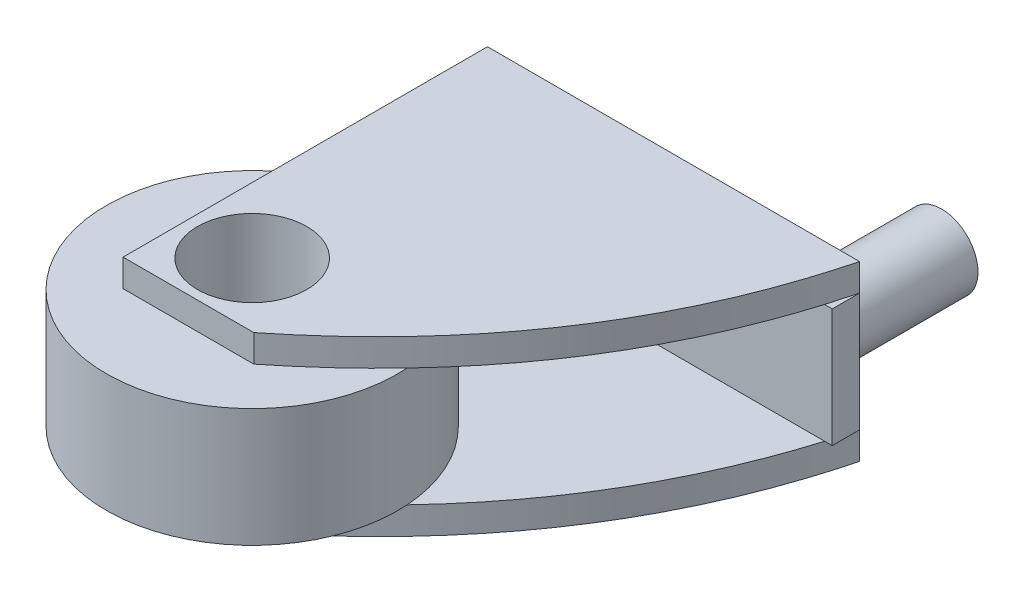
ISO-10303-21;
HEADER;
FILE_DESCRIPTION(('STEP AP214'),'2;1');
FILE_NAME('part.step','',(''),(''),'','','');
FILE_SCHEMA(('AUTOMOTIVE_DESIGN { 1 0 10303 214 1 1 1 1 }'));
ENDSEC;
DATA;
#1=APPLICATION_CONTEXT('core data for automotive mechanical design processes');
#2=APPLICATION_PROTOCOL_DEFINITION('international standard','automotive_design',2000,#1);
#3=PRODUCT_CONTEXT('',#1,'mechanical');
#4=PRODUCT('Part','Part','',(#3));
#5=PRODUCT_RELATED_PRODUCT_CATEGORY('part','',(#4));
#6=PRODUCT_DEFINITION_FORMATION('','',#4);
#7=PRODUCT_DEFINITION_CONTEXT('part definition',#1,'design');
#8=PRODUCT_DEFINITION('design','',#6,#7);
#9=PRODUCT_DEFINITION_SHAPE('','',#8);
#10=(LENGTH_UNIT() NAMED_UNIT(*) SI_UNIT(.MILLI.,.METRE.));
#11=(NAMED_UNIT(*) PLANE_ANGLE_UNIT() SI_UNIT($,.RADIAN.));
#12=(NAMED_UNIT(*) SI_UNIT($,.STERADIAN.) SOLID_ANGLE_UNIT());
#13=UNCERTAINTY_MEASURE_WITH_UNIT(LENGTH_MEASURE(1.E-05),#10,'distance_accuracy_value','');
#14=(GEOMETRIC_REPRESENTATION_CONTEXT(3) GLOBAL_UNCERTAINTY_ASSIGNED_CONTEXT((#13)) GLOBAL_UNIT_ASSIGNED_CONTEXT((#10,
#11,#12)) REPRESENTATION_CONTEXT('',''));
#15=CARTESIAN_POINT('',(0.,0.,0.));
#16=DIRECTION('',(0.,0.,1.));
#17=DIRECTION('',(1.,0.,0.));
#18=AXIS2_PLACEMENT_3D('',#15,#16,#17);
#19=CARTESIAN_POINT('',(23.9622706191758,13.,-11.0935546528052));
#20=DIRECTION('',(0.,1.,0.));
#21=DIRECTION('',(0.,0.,1.));
#22=AXIS2_PLACEMENT_3D('',#19,#20,#21);
#23=PLANE('',#22);
#24=DIRECTION('',(-1.,0.,0.));
#25=VECTOR('',#24,1.);
#26=CARTESIAN_POINT('',(0.,13.,-30.));
#27=LINE('',#26,#25);
#28=CARTESIAN_POINT('',(32.8241863871167,13.,-30.));
#29=VERTEX_POINT('',#28);
#30=CARTESIAN_POINT('',(-7.17425851162196,13.,-30.));
#31=VERTEX_POINT('',#30);
#32=EDGE_CURVE('E124',#29,#31,#27,.T.);
#33=ORIENTED_EDGE('',*,*,#32,.F.);
#34=CARTESIAN_POINT('',(7.17425851162196,13.,6.9947751022262));
#35=CARTESIAN_POINT('',(27.5045815804378,13.,-9.18449685672359));
#36=CARTESIAN_POINT('',(33.6656608042057,13.,-33.));
#37=B_SPLINE_CURVE_WITH_KNOTS('',2,(#34,#35,#36),.UNSPECIFIED.,.F.,.F.,(3,3),(0.,1.),.UNSPECIFIED.);
#38=CARTESIAN_POINT('',(15.9654632648895,13.,-1.0507058282246));
#39=VERTEX_POINT('',#38);
#40=EDGE_CURVE('E193',#39,#29,#37,.T.);
#41=ORIENTED_EDGE('',*,*,#40,.F.);
#42=CARTESIAN_POINT('',(0.,13.,0.));
#43=DIRECTION('',(0.,1.,0.));
#44=DIRECTION('',(0.,0.,1.));
#45=AXIS2_PLACEMENT_3D('',#42,#43,#44);
#46=CIRCLE('',#45,16.);
#47=CARTESIAN_POINT('',(-7.17425851162196,13.,-14.301399050737));
#48=VERTEX_POINT('',#47);
#49=EDGE_CURVE('E149',#39,#48,#46,.T.);
#50=ORIENTED_EDGE('',*,*,#49,.T.);
#51=DIRECTION('',(0.,0.,1.));
#52=VECTOR('',#51,1.);
#53=CARTESIAN_POINT('',(-7.17425851162196,13.,6.9947751022262));
#54=LINE('',#53,#52);
#55=EDGE_CURVE('E140',#31,#48,#54,.T.);
#56=ORIENTED_EDGE('',*,*,#55,.F.);
#57=EDGE_LOOP('',(#33,#41,#50,#56));
#58=FACE_BOUND('',#57,.T.);
#59=ADVANCED_FACE('F35',(#58),#23,.F.);
#60=CARTESIAN_POINT('',(23.9622706191758,0.,-11.0935546528052));
#61=DIRECTION('',(0.,-1.,0.));
#62=DIRECTION('',(0.,0.,1.));
#63=AXIS2_PLACEMENT_3D('',#60,#61,#62);
#64=PLANE('',#63);
#65=DIRECTION('',(-1.,0.,0.));
#66=VECTOR('',#65,1.);
#67=CARTESIAN_POINT('',(0.,0.,-30.));
#68=LINE('',#67,#66);
#69=CARTESIAN_POINT('',(32.8241863871174,0.,-30.0000000000002));
#70=VERTEX_POINT('',#69);
#71=CARTESIAN_POINT('',(-7.17425851162196,0.,-30.));
#72=VERTEX_POINT('',#71);
#73=EDGE_CURVE('E327',#70,#72,#68,.T.);
#74=ORIENTED_EDGE('',*,*,#73,.T.);
#75=DIRECTION('',(0.,0.,1.));
#76=VECTOR('',#75,1.);
#77=CARTESIAN_POINT('',(-7.17425851162196,0.,6.9947751022262));
#78=LINE('',#77,#76);
#79=CARTESIAN_POINT('',(-7.17425851162196,0.,-14.3013990507369));
#80=VERTEX_POINT('',#79);
#81=EDGE_CURVE('E143',#72,#80,#78,.T.);
#82=ORIENTED_EDGE('',*,*,#81,.T.);
#83=CARTESIAN_POINT('',(0.,0.,0.));
#84=DIRECTION('',(0.,1.,0.));
#85=DIRECTION('',(0.,0.,1.));
#86=AXIS2_PLACEMENT_3D('',#83,#84,#85);
#87=CIRCLE('',#86,16.);
#88=CARTESIAN_POINT('',(15.9654632648895,0.,-1.0507058282246));
#89=VERTEX_POINT('',#88);
#90=EDGE_CURVE('E166',#89,#80,#87,.T.);
#91=ORIENTED_EDGE('',*,*,#90,.F.);
#92=CARTESIAN_POINT('',(7.17425851162196,0.,6.9947751022262));
#93=CARTESIAN_POINT('',(27.5045815804378,0.,-9.18449685672359));
#94=CARTESIAN_POINT('',(33.6656608042057,0.,-33.));
#95=B_SPLINE_CURVE_WITH_KNOTS('',2,(#92,#93,#94),.UNSPECIFIED.,.F.,.F.,(3,3),(0.,1.),.UNSPECIFIED.);
#96=EDGE_CURVE('E54',#89,#70,#95,.T.);
#97=ORIENTED_EDGE('',*,*,#96,.T.);
#98=EDGE_LOOP('',(#74,#82,#91,#97));
#99=FACE_BOUND('',#98,.T.);
#100=ADVANCED_FACE('F242',(#99),#64,.F.);
#101=CARTESIAN_POINT('',(0.,13.,0.));
#102=DIRECTION('',(0.,1.,0.));
#103=DIRECTION('',(0.,0.,1.));
#104=AXIS2_PLACEMENT_3D('',#101,#102,#103);
#105=PLANE('',#104);
#106=CARTESIAN_POINT('',(-7.17425851162196,13.,6.9947751022262));
#107=VERTEX_POINT('',#106);
#108=EDGE_CURVE('E153',#48,#107,#54,.T.);
#109=ORIENTED_EDGE('',*,*,#108,.F.);
#110=EDGE_CURVE('E164',#48,#39,#46,.T.);
#111=ORIENTED_EDGE('',*,*,#110,.T.);
#112=CARTESIAN_POINT('',(7.17425851162196,13.,6.9947751022262));
#113=VERTEX_POINT('',#112);
#114=EDGE_CURVE('E189',#113,#39,#37,.T.);
#115=ORIENTED_EDGE('',*,*,#114,.F.);
#116=DIRECTION('',(1.,0.,0.));
#117=VECTOR('',#116,1.);
#118=CARTESIAN_POINT('',(-7.17425851162196,13.,6.9947751022262));
#119=LINE('',#118,#117);
#120=EDGE_CURVE('E150',#107,#113,#119,.T.);
#121=ORIENTED_EDGE('',*,*,#120,.F.);
#122=EDGE_LOOP('',(#109,#111,#115,#121));
#123=FACE_BOUND('',#122,.T.);
#124=ADVANCED_FACE('F239',(#123),#105,.T.);
#125=CARTESIAN_POINT('',(0.,0.,0.));
#126=DIRECTION('',(0.,1.,0.));
#127=DIRECTION('',(0.,0.,1.));
#128=AXIS2_PLACEMENT_3D('',#125,#126,#127);
#129=PLANE('',#128);
#130=EDGE_CURVE('E171',#80,#89,#87,.T.);
#131=ORIENTED_EDGE('',*,*,#130,.F.);
#132=CARTESIAN_POINT('',(-7.17425851162196,0.,6.9947751022262));
#133=VERTEX_POINT('',#132);
#134=EDGE_CURVE('E43',#80,#133,#78,.T.);
#135=ORIENTED_EDGE('',*,*,#134,.T.);
#136=DIRECTION('',(1.,0.,0.));
#137=VECTOR('',#136,1.);
#138=CARTESIAN_POINT('',(-7.17425851162196,0.,6.9947751022262));
#139=LINE('',#138,#137);
#140=CARTESIAN_POINT('',(7.17425851162196,0.,6.9947751022262));
#141=VERTEX_POINT('',#140);
#142=EDGE_CURVE('E288',#133,#141,#139,.T.);
#143=ORIENTED_EDGE('',*,*,#142,.T.);
#144=EDGE_CURVE('E283',#141,#89,#95,.T.);
#145=ORIENTED_EDGE('',*,*,#144,.T.);
#146=EDGE_LOOP('',(#131,#135,#143,#145));
#147=FACE_BOUND('',#146,.T.);
#148=ADVANCED_FACE('F241',(#147),#129,.F.);
#149=CARTESIAN_POINT('',(0.,13.,0.));
#150=DIRECTION('',(0.,-1.,0.));
#151=DIRECTION('',(0.,0.,-1.));
#152=AXIS2_PLACEMENT_3D('',#149,#150,#151);
#153=CYLINDRICAL_SURFACE('',#152,16.);
#154=ORIENTED_EDGE('',*,*,#49,.F.);
#155=ORIENTED_EDGE('',*,*,#110,.F.);
#156=EDGE_LOOP('',(#154,#155));
#157=FACE_BOUND('',#156,.T.);
#158=ORIENTED_EDGE('',*,*,#90,.T.);
#159=ORIENTED_EDGE('',*,*,#130,.T.);
#160=EDGE_LOOP('',(#158,#159));
#161=FACE_BOUND('',#160,.T.);
#162=ADVANCED_FACE('F37',(#157,#161),#153,.T.);
#163=CARTESIAN_POINT('',(23.9622706191758,16.,-11.0935546528052));
#164=DIRECTION('',(0.,1.,0.));
#165=DIRECTION('',(0.,0.,1.));
#166=AXIS2_PLACEMENT_3D('',#163,#164,#165);
#167=PLANE('',#166);
#168=CARTESIAN_POINT('',(0.,16.,0.));
#169=DIRECTION('',(0.,1.,0.));
#170=DIRECTION('',(0.,0.,1.));
#171=AXIS2_PLACEMENT_3D('',#168,#169,#170);
#172=CIRCLE('',#171,6.);
#173=CARTESIAN_POINT('',(0.,16.,-6.));
#174=VERTEX_POINT('',#173);
#175=EDGE_CURVE('E331',#174,#174,#172,.T.);
#176=ORIENTED_EDGE('',*,*,#175,.F.);
#177=EDGE_LOOP('',(#176));
#178=FACE_BOUND('',#177,.T.);
#179=DIRECTION('',(0.,0.,1.));
#180=VECTOR('',#179,1.);
#181=CARTESIAN_POINT('',(-7.17425851162196,16.,6.9947751022262));
#182=LINE('',#181,#180);
#183=CARTESIAN_POINT('',(-7.17425851162196,16.,-33.));
#184=VERTEX_POINT('',#183);
#185=CARTESIAN_POINT('',(-7.17425851162196,16.,6.9947751022262));
#186=VERTEX_POINT('',#185);
#187=EDGE_CURVE('E192',#184,#186,#182,.T.);
#188=ORIENTED_EDGE('',*,*,#187,.T.);
#189=DIRECTION('',(1.,0.,0.));
#190=VECTOR('',#189,1.);
#191=CARTESIAN_POINT('',(-7.17425851162196,16.,6.9947751022262));
#192=LINE('',#191,#190);
#193=CARTESIAN_POINT('',(7.17425851162196,16.,6.9947751022262));
#194=VERTEX_POINT('',#193);
#195=EDGE_CURVE('E198',#186,#194,#192,.T.);
#196=ORIENTED_EDGE('',*,*,#195,.T.);
#197=CARTESIAN_POINT('',(7.17425851162196,16.,6.9947751022262));
#198=CARTESIAN_POINT('',(27.5045815804378,16.,-9.18449685672359));
#199=CARTESIAN_POINT('',(33.6656608042057,16.,-33.));
#200=B_SPLINE_CURVE_WITH_KNOTS('',2,(#197,#198,#199),.UNSPECIFIED.,.F.,.F.,(3,3),(0.,1.),.UNSPECIFIED.);
#201=CARTESIAN_POINT('',(33.6656608042057,16.,-33.));
#202=VERTEX_POINT('',#201);
#203=EDGE_CURVE('E214',#194,#202,#200,.T.);
#204=ORIENTED_EDGE('',*,*,#203,.T.);
#205=DIRECTION('',(-1.,0.,0.));
#206=VECTOR('',#205,1.);
#207=CARTESIAN_POINT('',(7.17425851162196,16.,-33.));
#208=LINE('',#207,#206);
#209=EDGE_CURVE('E188',#202,#184,#208,.T.);
#210=ORIENTED_EDGE('',*,*,#209,.T.);
#211=EDGE_LOOP('',(#188,#196,#204,#210));
#212=FACE_BOUND('',#211,.T.);
#213=ADVANCED_FACE('F249',(#178,#212),#167,.T.);
#214=CARTESIAN_POINT('',(-7.17425851162196,16.,-33.));
#215=DIRECTION('',(0.,0.,1.));
#216=DIRECTION('',(1.,0.,0.));
#217=AXIS2_PLACEMENT_3D('',#214,#215,#216);
#218=PLANE('',#217);
#219=CARTESIAN_POINT('',(27.6656608042057,6.5,-33.));
#220=DIRECTION('',(0.,0.,1.));
#221=DIRECTION('',(1.,0.,0.));
#222=AXIS2_PLACEMENT_3D('',#219,#220,#221);
#223=CIRCLE('',#222,4.);
#224=CARTESIAN_POINT('',(31.6656608042057,6.5,-33.));
#225=VERTEX_POINT('',#224);
#226=EDGE_CURVE('E11',#225,#225,#223,.F.);
#227=ORIENTED_EDGE('',*,*,#226,.F.);
#228=EDGE_LOOP('',(#227));
#229=FACE_BOUND('',#228,.T.);
#230=DIRECTION('',(0.,-1.,0.));
#231=VECTOR('',#230,1.);
#232=CARTESIAN_POINT('',(33.6656608042057,16.,-33.));
#233=LINE('',#232,#231);
#234=CARTESIAN_POINT('',(33.6656608042057,13.,-33.));
#235=VERTEX_POINT('',#234);
#236=EDGE_CURVE('E178',#202,#235,#233,.T.);
#237=ORIENTED_EDGE('',*,*,#236,.T.);
#238=DIRECTION('',(0.,-1.,0.));
#239=VECTOR('',#238,1.);
#240=CARTESIAN_POINT('',(33.6656608042057,0.,-33.));
#241=LINE('',#240,#239);
#242=CARTESIAN_POINT('',(33.6656608042057,0.,-33.));
#243=VERTEX_POINT('',#242);
#244=EDGE_CURVE('E145',#235,#243,#241,.T.);
#245=ORIENTED_EDGE('',*,*,#244,.T.);
#246=DIRECTION('',(0.,1.,0.));
#247=VECTOR('',#246,1.);
#248=CARTESIAN_POINT('',(33.6656608042057,-3.,-33.));
#249=LINE('',#248,#247);
#250=CARTESIAN_POINT('',(33.6656608042057,-3.,-33.));
#251=VERTEX_POINT('',#250);
#252=EDGE_CURVE('E151',#251,#243,#249,.T.);
#253=ORIENTED_EDGE('',*,*,#252,.F.);
#254=DIRECTION('',(-1.,0.,0.));
#255=VECTOR('',#254,1.);
#256=CARTESIAN_POINT('',(-7.17425851162196,-3.,-33.));
#257=LINE('',#256,#255);
#258=CARTESIAN_POINT('',(-7.17425851162196,-3.,-33.));
#259=VERTEX_POINT('',#258);
#260=EDGE_CURVE('E275',#251,#259,#257,.T.);
#261=ORIENTED_EDGE('',*,*,#260,.T.);
#262=DIRECTION('',(0.,-1.,0.));
#263=VECTOR('',#262,1.);
#264=CARTESIAN_POINT('',(-7.17425851162196,16.,-33.));
#265=LINE('',#264,#263);
#266=EDGE_CURVE('E184',#184,#259,#265,.T.);
#267=ORIENTED_EDGE('',*,*,#266,.F.);
#268=ORIENTED_EDGE('',*,*,#209,.F.);
#269=EDGE_LOOP('',(#237,#245,#253,#261,#267,#268));
#270=FACE_BOUND('',#269,.T.);
#271=ADVANCED_FACE('F207',(#229,#270),#218,.F.);
#272=DIRECTION('',(0.,-1.,0.));
#273=VECTOR('',#272,1.);
#274=SURFACE_OF_LINEAR_EXTRUSION('',#200,#273);
#275=ORIENTED_EDGE('',*,*,#114,.T.);
#276=ORIENTED_EDGE('',*,*,#40,.T.);
#277=EDGE_CURVE('E155',#29,#235,#37,.T.);
#278=ORIENTED_EDGE('',*,*,#277,.T.);
#279=ORIENTED_EDGE('',*,*,#236,.F.);
#280=ORIENTED_EDGE('',*,*,#203,.F.);
#281=DIRECTION('',(0.,-1.,0.));
#282=VECTOR('',#281,1.);
#283=CARTESIAN_POINT('',(7.17425851162196,16.,6.9947751022262));
#284=LINE('',#283,#282);
#285=EDGE_CURVE('E175',#194,#113,#284,.T.);
#286=ORIENTED_EDGE('',*,*,#285,.T.);
#287=EDGE_LOOP('',(#275,#276,#278,#279,#280,#286));
#288=FACE_BOUND('',#287,.T.);
#289=ADVANCED_FACE('F202',(#288),#274,.F.);
#290=CARTESIAN_POINT('',(-7.17425851162196,16.,6.9947751022262));
#291=DIRECTION('',(0.,0.,-1.));
#292=DIRECTION('',(-1.,0.,0.));
#293=AXIS2_PLACEMENT_3D('',#290,#291,#292);
#294=PLANE('',#293);
#295=ORIENTED_EDGE('',*,*,#120,.T.);
#296=ORIENTED_EDGE('',*,*,#285,.F.);
#297=ORIENTED_EDGE('',*,*,#195,.F.);
#298=DIRECTION('',(0.,-1.,0.));
#299=VECTOR('',#298,1.);
#300=CARTESIAN_POINT('',(-7.17425851162196,16.,6.9947751022262));
#301=LINE('',#300,#299);
#302=EDGE_CURVE('E168',#186,#107,#301,.T.);
#303=ORIENTED_EDGE('',*,*,#302,.T.);
#304=EDGE_LOOP('',(#295,#296,#297,#303));
#305=FACE_BOUND('',#304,.T.);
#306=ADVANCED_FACE('F227',(#305),#294,.F.);
#307=CARTESIAN_POINT('',(-7.17425851162196,16.,6.9947751022262));
#308=DIRECTION('',(1.,0.,0.));
#309=DIRECTION('',(0.,0.,-1.));
#310=AXIS2_PLACEMENT_3D('',#307,#308,#309);
#311=PLANE('',#310);
#312=ORIENTED_EDGE('',*,*,#266,.T.);
#313=DIRECTION('',(0.,0.,1.));
#314=VECTOR('',#313,1.);
#315=CARTESIAN_POINT('',(-7.17425851162196,-3.,6.9947751022262));
#316=LINE('',#315,#314);
#317=CARTESIAN_POINT('',(-7.17425851162196,-3.,6.9947751022262));
#318=VERTEX_POINT('',#317);
#319=EDGE_CURVE('E294',#259,#318,#316,.T.);
#320=ORIENTED_EDGE('',*,*,#319,.T.);
#321=DIRECTION('',(0.,1.,0.));
#322=VECTOR('',#321,1.);
#323=CARTESIAN_POINT('',(-7.17425851162196,-3.,6.9947751022262));
#324=LINE('',#323,#322);
#325=EDGE_CURVE('E281',#318,#133,#324,.T.);
#326=ORIENTED_EDGE('',*,*,#325,.T.);
#327=ORIENTED_EDGE('',*,*,#134,.F.);
#328=ORIENTED_EDGE('',*,*,#81,.F.);
#329=DIRECTION('',(0.,-1.,0.));
#330=VECTOR('',#329,1.);
#331=CARTESIAN_POINT('',(-7.17425851162196,0.,-30.));
#332=LINE('',#331,#330);
#333=EDGE_CURVE('E128',#31,#72,#332,.T.);
#334=ORIENTED_EDGE('',*,*,#333,.F.);
#335=ORIENTED_EDGE('',*,*,#55,.T.);
#336=ORIENTED_EDGE('',*,*,#108,.T.);
#337=ORIENTED_EDGE('',*,*,#302,.F.);
#338=ORIENTED_EDGE('',*,*,#187,.F.);
#339=EDGE_LOOP('',(#312,#320,#326,#327,#328,#334,#335,#336,#337,#338));
#340=FACE_BOUND('',#339,.T.);
#341=ADVANCED_FACE('F138',(#340),#311,.F.);
#342=CARTESIAN_POINT('',(23.9622706191758,-3.,-11.0935546528052));
#343=DIRECTION('',(0.,-1.,0.));
#344=DIRECTION('',(0.,0.,1.));
#345=AXIS2_PLACEMENT_3D('',#342,#343,#344);
#346=PLANE('',#345);
#347=CARTESIAN_POINT('',(0.,-3.,0.));
#348=DIRECTION('',(0.,-1.,0.));
#349=DIRECTION('',(0.,0.,-1.));
#350=AXIS2_PLACEMENT_3D('',#347,#348,#349);
#351=CIRCLE('',#350,6.);
#352=CARTESIAN_POINT('',(0.,-3.,-6.));
#353=VERTEX_POINT('',#352);
#354=EDGE_CURVE('E334',#353,#353,#351,.T.);
#355=ORIENTED_EDGE('',*,*,#354,.F.);
#356=EDGE_LOOP('',(#355));
#357=FACE_BOUND('',#356,.T.);
#358=ORIENTED_EDGE('',*,*,#319,.F.);
#359=ORIENTED_EDGE('',*,*,#260,.F.);
#360=CARTESIAN_POINT('',(7.17425851162196,-3.,6.9947751022262));
#361=CARTESIAN_POINT('',(27.5045815804378,-3.,-9.18449685672359));
#362=CARTESIAN_POINT('',(33.6656608042057,-3.,-33.));
#363=B_SPLINE_CURVE_WITH_KNOTS('',2,(#360,#361,#362),.UNSPECIFIED.,.F.,.F.,(3,3),(0.,1.),.UNSPECIFIED.);
#364=CARTESIAN_POINT('',(7.17425851162196,-3.,6.9947751022262));
#365=VERTEX_POINT('',#364);
#366=EDGE_CURVE('E267',#365,#251,#363,.T.);
#367=ORIENTED_EDGE('',*,*,#366,.F.);
#368=DIRECTION('',(1.,0.,0.));
#369=VECTOR('',#368,1.);
#370=CARTESIAN_POINT('',(-7.17425851162196,-3.,6.9947751022262));
#371=LINE('',#370,#369);
#372=EDGE_CURVE('E274',#318,#365,#371,.T.);
#373=ORIENTED_EDGE('',*,*,#372,.F.);
#374=EDGE_LOOP('',(#358,#359,#367,#373));
#375=FACE_BOUND('',#374,.T.);
#376=ADVANCED_FACE('F233',(#357,#375),#346,.T.);
#377=CARTESIAN_POINT('',(-7.17425851162196,-3.,6.9947751022262));
#378=DIRECTION('',(0.,0.,1.));
#379=DIRECTION('',(1.,0.,0.));
#380=AXIS2_PLACEMENT_3D('',#377,#378,#379);
#381=PLANE('',#380);
#382=ORIENTED_EDGE('',*,*,#142,.F.);
#383=ORIENTED_EDGE('',*,*,#325,.F.);
#384=ORIENTED_EDGE('',*,*,#372,.T.);
#385=DIRECTION('',(0.,1.,0.));
#386=VECTOR('',#385,1.);
#387=CARTESIAN_POINT('',(7.17425851162196,-3.,6.9947751022262));
#388=LINE('',#387,#386);
#389=EDGE_CURVE('E157',#365,#141,#388,.T.);
#390=ORIENTED_EDGE('',*,*,#389,.T.);
#391=EDGE_LOOP('',(#382,#383,#384,#390));
#392=FACE_BOUND('',#391,.T.);
#393=ADVANCED_FACE('F266',(#392),#381,.T.);
#394=DIRECTION('',(0.,1.,0.));
#395=VECTOR('',#394,1.);
#396=SURFACE_OF_LINEAR_EXTRUSION('',#363,#395);
#397=ORIENTED_EDGE('',*,*,#144,.F.);
#398=ORIENTED_EDGE('',*,*,#389,.F.);
#399=ORIENTED_EDGE('',*,*,#366,.T.);
#400=ORIENTED_EDGE('',*,*,#252,.T.);
#401=CARTESIAN_POINT('',(7.17425851162196,0.,6.9947751022262));
#402=CARTESIAN_POINT('',(27.5045815804378,0.,-9.18449685672359));
#403=CARTESIAN_POINT('',(33.6656608042057,0.,-33.));
#404=B_SPLINE_CURVE_WITH_KNOTS('',2,(#401,#402,#403),.UNSPECIFIED.,.F.,.F.,(3,3),(0.,1.),.UNSPECIFIED.);
#405=EDGE_CURVE('E50',#70,#243,#404,.T.);
#406=ORIENTED_EDGE('',*,*,#405,.F.);
#407=ORIENTED_EDGE('',*,*,#96,.F.);
#408=EDGE_LOOP('',(#397,#398,#399,#400,#406,#407));
#409=FACE_BOUND('',#408,.T.);
#410=ADVANCED_FACE('F261',(#409),#396,.T.);
#411=CARTESIAN_POINT('',(0.,13.,-30.));
#412=DIRECTION('',(0.,-1.,0.));
#413=DIRECTION('',(0.,0.,-1.));
#414=AXIS2_PLACEMENT_3D('',#411,#412,#413);
#415=PLANE('',#414);
#416=DIRECTION('',(0.,0.,-1.));
#417=VECTOR('',#416,1.);
#418=CARTESIAN_POINT('',(33.6656608042057,13.,-30.));
#419=LINE('',#418,#417);
#420=CARTESIAN_POINT('',(33.6656608042057,13.,-30.));
#421=VERTEX_POINT('',#420);
#422=EDGE_CURVE('E315',#421,#235,#419,.T.);
#423=ORIENTED_EDGE('',*,*,#422,.T.);
#424=ORIENTED_EDGE('',*,*,#277,.F.);
#425=EDGE_CURVE('E131',#421,#29,#27,.T.);
#426=ORIENTED_EDGE('',*,*,#425,.F.);
#427=EDGE_LOOP('',(#423,#424,#426));
#428=FACE_BOUND('',#427,.T.);
#429=ADVANCED_FACE('F265',(#428),#415,.F.);
#430=CARTESIAN_POINT('',(0.,0.,-30.));
#431=DIRECTION('',(0.,-1.,0.));
#432=DIRECTION('',(0.,0.,-1.));
#433=AXIS2_PLACEMENT_3D('',#430,#431,#432);
#434=PLANE('',#433);
#435=CARTESIAN_POINT('',(33.6656608042057,0.,-30.));
#436=VERTEX_POINT('',#435);
#437=EDGE_CURVE('E310',#436,#70,#68,.T.);
#438=ORIENTED_EDGE('',*,*,#437,.T.);
#439=ORIENTED_EDGE('',*,*,#405,.T.);
#440=DIRECTION('',(0.,0.,-1.));
#441=VECTOR('',#440,1.);
#442=CARTESIAN_POINT('',(33.6656608042057,0.,-30.));
#443=LINE('',#442,#441);
#444=EDGE_CURVE('E307',#436,#243,#443,.T.);
#445=ORIENTED_EDGE('',*,*,#444,.F.);
#446=EDGE_LOOP('',(#438,#439,#445));
#447=FACE_BOUND('',#446,.T.);
#448=ADVANCED_FACE('F306',(#447),#434,.T.);
#449=CARTESIAN_POINT('',(33.6656608042057,0.,-30.));
#450=DIRECTION('',(1.,0.,0.));
#451=DIRECTION('',(0.,0.,-1.));
#452=AXIS2_PLACEMENT_3D('',#449,#450,#451);
#453=PLANE('',#452);
#454=ORIENTED_EDGE('',*,*,#244,.F.);
#455=ORIENTED_EDGE('',*,*,#422,.F.);
#456=DIRECTION('',(0.,-1.,0.));
#457=VECTOR('',#456,1.);
#458=CARTESIAN_POINT('',(33.6656608042057,0.,-30.));
#459=LINE('',#458,#457);
#460=EDGE_CURVE('E314',#421,#436,#459,.T.);
#461=ORIENTED_EDGE('',*,*,#460,.T.);
#462=ORIENTED_EDGE('',*,*,#444,.T.);
#463=EDGE_LOOP('',(#454,#455,#461,#462));
#464=FACE_BOUND('',#463,.T.);
#465=ADVANCED_FACE('F313',(#464),#453,.T.);
#466=CARTESIAN_POINT('',(0.,0.,-30.));
#467=DIRECTION('',(0.,0.,-1.));
#468=DIRECTION('',(-1.,0.,0.));
#469=AXIS2_PLACEMENT_3D('',#466,#467,#468);
#470=PLANE('',#469);
#471=ORIENTED_EDGE('',*,*,#333,.T.);
#472=ORIENTED_EDGE('',*,*,#73,.F.);
#473=ORIENTED_EDGE('',*,*,#437,.F.);
#474=ORIENTED_EDGE('',*,*,#460,.F.);
#475=ORIENTED_EDGE('',*,*,#425,.T.);
#476=ORIENTED_EDGE('',*,*,#32,.T.);
#477=EDGE_LOOP('',(#471,#472,#473,#474,#475,#476));
#478=FACE_BOUND('',#477,.T.);
#479=ADVANCED_FACE('F126',(#478),#470,.F.);
#480=CARTESIAN_POINT('',(27.6656608042057,6.5,-48.));
#481=DIRECTION('',(0.,0.,1.));
#482=DIRECTION('',(1.,0.,0.));
#483=AXIS2_PLACEMENT_3D('',#480,#481,#482);
#484=CYLINDRICAL_SURFACE('',#483,4.);
#485=CARTESIAN_POINT('',(27.6656608042057,6.5,-48.));
#486=DIRECTION('',(0.,0.,-1.));
#487=DIRECTION('',(-1.,0.,0.));
#488=AXIS2_PLACEMENT_3D('',#485,#486,#487);
#489=CIRCLE('',#488,4.);
#490=CARTESIAN_POINT('',(23.6656608042057,6.5,-48.));
#491=VERTEX_POINT('',#490);
#492=EDGE_CURVE('E325',#491,#491,#489,.T.);
#493=ORIENTED_EDGE('',*,*,#492,.F.);
#494=EDGE_LOOP('',(#493));
#495=FACE_BOUND('',#494,.T.);
#496=ORIENTED_EDGE('',*,*,#226,.T.);
#497=EDGE_LOOP('',(#496));
#498=FACE_BOUND('',#497,.T.);
#499=ADVANCED_FACE('F353',(#495,#498),#484,.T.);
#500=CARTESIAN_POINT('',(27.6656608042057,6.5,-48.));
#501=DIRECTION('',(0.,0.,-1.));
#502=DIRECTION('',(-1.,0.,0.));
#503=AXIS2_PLACEMENT_3D('',#500,#501,#502);
#504=PLANE('',#503);
#505=ORIENTED_EDGE('',*,*,#492,.T.);
#506=EDGE_LOOP('',(#505));
#507=FACE_BOUND('',#506,.T.);
#508=ADVANCED_FACE('F237',(#507),#504,.T.);
#509=CARTESIAN_POINT('',(0.,13.,0.));
#510=DIRECTION('',(0.,-1.,0.));
#511=DIRECTION('',(0.,0.,-1.));
#512=AXIS2_PLACEMENT_3D('',#509,#510,#511);
#513=CYLINDRICAL_SURFACE('',#512,6.);
#514=CARTESIAN_POINT('',(0.,16.,-6.));
#515=CARTESIAN_POINT('',(0.,15.8020833333333,-6.));
#516=CARTESIAN_POINT('',(0.,15.6041666666667,-6.));
#517=CARTESIAN_POINT('',(0.,15.2083333333333,-6.));
#518=CARTESIAN_POINT('',(0.,15.0104166666667,-6.));
#519=CARTESIAN_POINT('',(0.,14.6145833333333,-6.));
#520=CARTESIAN_POINT('',(0.,14.4166666666667,-6.));
#521=CARTESIAN_POINT('',(0.,14.0208333333333,-6.));
#522=CARTESIAN_POINT('',(0.,13.8229166666667,-6.));
#523=CARTESIAN_POINT('',(0.,13.4270833333333,-6.));
#524=CARTESIAN_POINT('',(0.,13.2291666666667,-6.));
#525=CARTESIAN_POINT('',(0.,12.8333333333333,-6.));
#526=CARTESIAN_POINT('',(0.,12.6354166666667,-6.));
#527=CARTESIAN_POINT('',(0.,12.2395833333333,-6.));
#528=CARTESIAN_POINT('',(0.,12.0416666666667,-6.));
#529=CARTESIAN_POINT('',(0.,11.6458333333333,-6.));
#530=CARTESIAN_POINT('',(0.,11.4479166666667,-6.));
#531=CARTESIAN_POINT('',(0.,11.0520833333333,-6.));
#532=CARTESIAN_POINT('',(0.,10.8541666666667,-6.));
#533=CARTESIAN_POINT('',(0.,10.4583333333333,-6.));
#534=CARTESIAN_POINT('',(0.,10.2604166666667,-6.));
#535=CARTESIAN_POINT('',(0.,9.86458333333333,-6.));
#536=CARTESIAN_POINT('',(0.,9.66666666666667,-6.));
#537=CARTESIAN_POINT('',(0.,9.27083333333333,-6.));
#538=CARTESIAN_POINT('',(0.,9.07291666666667,-6.));
#539=CARTESIAN_POINT('',(0.,8.67708333333333,-6.));
#540=CARTESIAN_POINT('',(0.,8.47916666666667,-6.));
#541=CARTESIAN_POINT('',(0.,8.08333333333333,-6.));
#542=CARTESIAN_POINT('',(0.,7.88541666666667,-6.));
#543=CARTESIAN_POINT('',(0.,7.48958333333333,-6.));
#544=CARTESIAN_POINT('',(0.,7.29166666666667,-6.));
#545=CARTESIAN_POINT('',(0.,6.89583333333333,-6.));
#546=CARTESIAN_POINT('',(0.,6.69791666666667,-6.));
#547=CARTESIAN_POINT('',(0.,6.30208333333333,-6.));
#548=CARTESIAN_POINT('',(0.,6.10416666666667,-6.));
#549=CARTESIAN_POINT('',(0.,5.70833333333333,-6.));
#550=CARTESIAN_POINT('',(0.,5.51041666666667,-6.));
#551=CARTESIAN_POINT('',(0.,5.11458333333333,-6.));
#552=CARTESIAN_POINT('',(0.,4.91666666666667,-6.));
#553=CARTESIAN_POINT('',(0.,4.52083333333333,-6.));
#554=CARTESIAN_POINT('',(0.,4.32291666666667,-6.));
#555=CARTESIAN_POINT('',(0.,3.92708333333333,-6.));
#556=CARTESIAN_POINT('',(0.,3.72916666666667,-6.));
#557=CARTESIAN_POINT('',(0.,3.33333333333333,-6.));
#558=CARTESIAN_POINT('',(0.,3.13541666666667,-6.));
#559=CARTESIAN_POINT('',(0.,2.73958333333333,-6.));
#560=CARTESIAN_POINT('',(0.,2.54166666666667,-6.));
#561=CARTESIAN_POINT('',(0.,2.14583333333333,-6.));
#562=CARTESIAN_POINT('',(0.,1.94791666666667,-6.));
#563=CARTESIAN_POINT('',(0.,1.55208333333333,-6.));
#564=CARTESIAN_POINT('',(0.,1.35416666666667,-6.));
#565=CARTESIAN_POINT('',(0.,0.958333333333334,-6.));
#566=CARTESIAN_POINT('',(0.,0.760416666666667,-6.));
#567=CARTESIAN_POINT('',(0.,0.364583333333334,-6.));
#568=CARTESIAN_POINT('',(0.,0.166666666666667,-6.));
#569=CARTESIAN_POINT('',(0.,-0.229166666666667,-6.));
#570=CARTESIAN_POINT('',(0.,-0.427083333333334,-6.));
#571=CARTESIAN_POINT('',(0.,-0.822916666666666,-6.));
#572=CARTESIAN_POINT('',(0.,-1.02083333333333,-6.));
#573=CARTESIAN_POINT('',(0.,-1.41666666666666,-6.));
#574=CARTESIAN_POINT('',(0.,-1.61458333333333,-6.));
#575=CARTESIAN_POINT('',(0.,-2.01041666666667,-6.));
#576=CARTESIAN_POINT('',(0.,-2.20833333333333,-6.));
#577=CARTESIAN_POINT('',(0.,-2.60416666666666,-6.));
#578=CARTESIAN_POINT('',(0.,-2.80208333333333,-6.));
#579=CARTESIAN_POINT('',(0.,-3.,-6.));
#580=B_SPLINE_CURVE_WITH_KNOTS('',3,(#514,#515,#516,#517,#518,#519,#520,#521,#522,#523,#524,
#525,#526,#527,#528,#529,#530,#531,#532,#533,#534,#535,#536,#537,#538,#539,#540,#541,#542,#543,
#544,#545,#546,#547,#548,#549,#550,#551,#552,#553,#554,#555,#556,#557,#558,#559,#560,#561,#562,
#563,#564,#565,#566,#567,#568,#569,#570,#571,#572,#573,#574,#575,#576,#577,#578,#579),
.UNSPECIFIED.,.F.,.F.,(4,2,2,2,2,2,2,2,2,2,2,2,2,2,2,2,2,2,2,2,2,2,2,2,2,2,2,2,2,2,2,2,4),(0.,
0.593749999999999,1.1875,1.78125,2.375,2.96875,3.5625,4.15625,4.75,5.34375,5.9375,6.53125,7.125,
7.71875,8.3125,8.90625,9.5,10.09375,10.6875,11.28125,11.875,12.46875,13.0625,13.65625,14.25,
14.84375,15.4375,16.03125,16.625,17.21875,17.8125,18.40625,19.),.UNSPECIFIED.);
#581=EDGE_CURVE('BSEAM234',#174,#353,#580,.T.);
#582=ORIENTED_EDGE('',*,*,#175,.T.);
#583=ORIENTED_EDGE('',*,*,#354,.T.);
#584=ORIENTED_EDGE('',*,*,#581,.T.);
#585=ORIENTED_EDGE('',*,*,#581,.F.);
#586=EDGE_LOOP('',(#582,#584,#583,#585));
#587=FACE_BOUND('',#586,.T.);
#588=ADVANCED_FACE('F234',(#587),#513,.F.);
#589=CLOSED_SHELL('',(#59,#100,#124,#148,#162,#213,#271,#289,#306,#341,#376,#393,#410,#429,#448,
#465,#479,#499,#508,#588));
#590=MANIFOLD_SOLID_BREP('B2',#589);
#591=ADVANCED_BREP_SHAPE_REPRESENTATION('',(#18,#590),#14);
#592=SHAPE_DEFINITION_REPRESENTATION(#9,#591);
ENDSEC;
END-ISO-10303-21;
